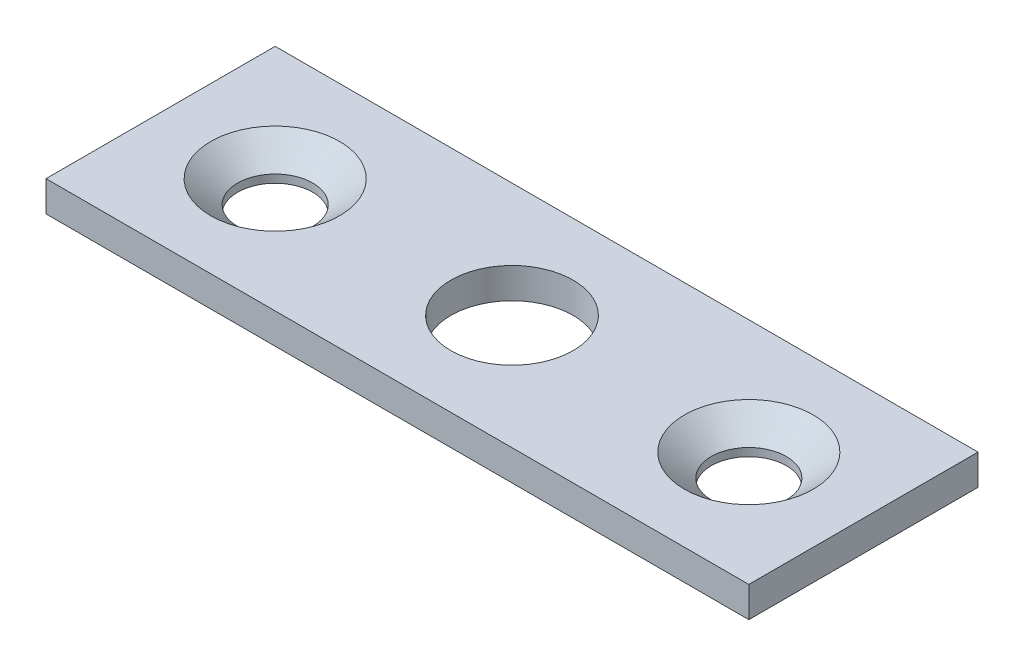
ISO-10303-21;
HEADER;
FILE_DESCRIPTION(('STEP AP214'),'2;1');
FILE_NAME('part.step','',(''),(''),'','','');
FILE_SCHEMA(('AUTOMOTIVE_DESIGN { 1 0 10303 214 1 1 1 1 }'));
ENDSEC;
DATA;
#1=APPLICATION_CONTEXT('core data for automotive mechanical design processes');
#2=APPLICATION_PROTOCOL_DEFINITION('international standard','automotive_design',2000,#1);
#3=PRODUCT_CONTEXT('',#1,'mechanical');
#4=PRODUCT('Part','Part','',(#3));
#5=PRODUCT_RELATED_PRODUCT_CATEGORY('part','',(#4));
#6=PRODUCT_DEFINITION_FORMATION('','',#4);
#7=PRODUCT_DEFINITION_CONTEXT('part definition',#1,'design');
#8=PRODUCT_DEFINITION('design','',#6,#7);
#9=PRODUCT_DEFINITION_SHAPE('','',#8);
#10=(LENGTH_UNIT() NAMED_UNIT(*) SI_UNIT(.MILLI.,.METRE.));
#11=(NAMED_UNIT(*) PLANE_ANGLE_UNIT() SI_UNIT($,.RADIAN.));
#12=(NAMED_UNIT(*) SI_UNIT($,.STERADIAN.) SOLID_ANGLE_UNIT());
#13=UNCERTAINTY_MEASURE_WITH_UNIT(LENGTH_MEASURE(1.E-05),#10,'distance_accuracy_value','');
#14=(GEOMETRIC_REPRESENTATION_CONTEXT(3) GLOBAL_UNCERTAINTY_ASSIGNED_CONTEXT((#13)) GLOBAL_UNIT_ASSIGNED_CONTEXT((#10,
#11,#12)) REPRESENTATION_CONTEXT('',''));
#15=CARTESIAN_POINT('',(0.,0.,0.));
#16=DIRECTION('',(0.,0.,1.));
#17=DIRECTION('',(1.,0.,0.));
#18=AXIS2_PLACEMENT_3D('',#15,#16,#17);
#19=CARTESIAN_POINT('',(0.,2.,0.));
#20=DIRECTION('',(0.,-1.,0.));
#21=DIRECTION('',(0.,0.,-1.));
#22=AXIS2_PLACEMENT_3D('',#19,#20,#21);
#23=PLANE('',#22);
#24=CARTESIAN_POINT('',(-15.5,2.,0.));
#25=DIRECTION('',(0.,1.,0.));
#26=DIRECTION('',(0.,0.,1.));
#27=AXIS2_PLACEMENT_3D('',#24,#25,#26);
#28=CIRCLE('',#27,4.2164);
#29=CARTESIAN_POINT('',(-15.5,2.,4.2164));
#30=VERTEX_POINT('',#29);
#31=EDGE_CURVE('E193',#30,#30,#28,.T.);
#32=ORIENTED_EDGE('',*,*,#31,.F.);
#33=EDGE_LOOP('',(#32));
#34=FACE_BOUND('',#33,.T.);
#35=CARTESIAN_POINT('',(15.5,2.,0.));
#36=DIRECTION('',(0.,1.,0.));
#37=DIRECTION('',(0.,0.,1.));
#38=AXIS2_PLACEMENT_3D('',#35,#36,#37);
#39=CIRCLE('',#38,4.2164);
#40=CARTESIAN_POINT('',(15.5,2.,4.2164));
#41=VERTEX_POINT('',#40);
#42=EDGE_CURVE('E125',#41,#41,#39,.T.);
#43=ORIENTED_EDGE('',*,*,#42,.F.);
#44=EDGE_LOOP('',(#43));
#45=FACE_BOUND('',#44,.T.);
#46=DIRECTION('',(0.,0.,-1.));
#47=VECTOR('',#46,1.);
#48=CARTESIAN_POINT('',(23.,2.,7.5));
#49=LINE('',#48,#47);
#50=CARTESIAN_POINT('',(23.,2.,7.5));
#51=VERTEX_POINT('',#50);
#52=CARTESIAN_POINT('',(23.,2.,-7.5));
#53=VERTEX_POINT('',#52);
#54=EDGE_CURVE('E95',#51,#53,#49,.T.);
#55=ORIENTED_EDGE('',*,*,#54,.T.);
#56=DIRECTION('',(-1.,0.,0.));
#57=VECTOR('',#56,1.);
#58=CARTESIAN_POINT('',(-23.,2.,-7.5));
#59=LINE('',#58,#57);
#60=CARTESIAN_POINT('',(-23.,2.,-7.5));
#61=VERTEX_POINT('',#60);
#62=EDGE_CURVE('E90',#53,#61,#59,.T.);
#63=ORIENTED_EDGE('',*,*,#62,.T.);
#64=DIRECTION('',(0.,0.,1.));
#65=VECTOR('',#64,1.);
#66=CARTESIAN_POINT('',(-23.,2.,7.5));
#67=LINE('',#66,#65);
#68=CARTESIAN_POINT('',(-23.,2.,7.5));
#69=VERTEX_POINT('',#68);
#70=EDGE_CURVE('E93',#61,#69,#67,.T.);
#71=ORIENTED_EDGE('',*,*,#70,.T.);
#72=DIRECTION('',(1.,0.,0.));
#73=VECTOR('',#72,1.);
#74=CARTESIAN_POINT('',(-23.,2.,7.5));
#75=LINE('',#74,#73);
#76=EDGE_CURVE('E60',#69,#51,#75,.T.);
#77=ORIENTED_EDGE('',*,*,#76,.T.);
#78=EDGE_LOOP('',(#55,#63,#71,#77));
#79=FACE_BOUND('',#78,.T.);
#80=CARTESIAN_POINT('',(0.,2.,0.));
#81=DIRECTION('',(0.,1.,0.));
#82=DIRECTION('',(0.,0.,1.));
#83=AXIS2_PLACEMENT_3D('',#80,#81,#82);
#84=CIRCLE('',#83,4.);
#85=CARTESIAN_POINT('',(0.,2.,4.));
#86=VERTEX_POINT('',#85);
#87=EDGE_CURVE('E111',#86,#86,#84,.T.);
#88=ORIENTED_EDGE('',*,*,#87,.F.);
#89=EDGE_LOOP('',(#88));
#90=FACE_BOUND('',#89,.T.);
#91=ADVANCED_FACE('F41',(#34,#45,#79,#90),#23,.F.);
#92=CARTESIAN_POINT('',(0.,0.,0.));
#93=DIRECTION('',(0.,-1.,0.));
#94=DIRECTION('',(0.,0.,-1.));
#95=AXIS2_PLACEMENT_3D('',#92,#93,#94);
#96=PLANE('',#95);
#97=CARTESIAN_POINT('',(-15.5,0.,0.));
#98=DIRECTION('',(0.,-1.,0.));
#99=DIRECTION('',(0.,0.,-1.));
#100=AXIS2_PLACEMENT_3D('',#97,#98,#99);
#101=CIRCLE('',#100,2.45744999999999);
#102=CARTESIAN_POINT('',(-15.5,0.,-2.45744999999999));
#103=VERTEX_POINT('',#102);
#104=EDGE_CURVE('E45',#103,#103,#101,.T.);
#105=ORIENTED_EDGE('',*,*,#104,.F.);
#106=EDGE_LOOP('',(#105));
#107=FACE_BOUND('',#106,.T.);
#108=CARTESIAN_POINT('',(15.5,0.,0.));
#109=DIRECTION('',(0.,-1.,0.));
#110=DIRECTION('',(0.,0.,-1.));
#111=AXIS2_PLACEMENT_3D('',#108,#109,#110);
#112=CIRCLE('',#111,2.45744999999999);
#113=CARTESIAN_POINT('',(15.5,0.,-2.45744999999999));
#114=VERTEX_POINT('',#113);
#115=EDGE_CURVE('E116',#114,#114,#112,.T.);
#116=ORIENTED_EDGE('',*,*,#115,.F.);
#117=EDGE_LOOP('',(#116));
#118=FACE_BOUND('',#117,.T.);
#119=DIRECTION('',(0.,0.,-1.));
#120=VECTOR('',#119,1.);
#121=CARTESIAN_POINT('',(23.,0.,7.5));
#122=LINE('',#121,#120);
#123=CARTESIAN_POINT('',(23.,0.,7.5));
#124=VERTEX_POINT('',#123);
#125=CARTESIAN_POINT('',(23.,0.,-7.5));
#126=VERTEX_POINT('',#125);
#127=EDGE_CURVE('E108',#124,#126,#122,.T.);
#128=ORIENTED_EDGE('',*,*,#127,.F.);
#129=DIRECTION('',(1.,0.,0.));
#130=VECTOR('',#129,1.);
#131=CARTESIAN_POINT('',(-23.,0.,7.5));
#132=LINE('',#131,#130);
#133=CARTESIAN_POINT('',(-23.,0.,7.5));
#134=VERTEX_POINT('',#133);
#135=EDGE_CURVE('E83',#134,#124,#132,.T.);
#136=ORIENTED_EDGE('',*,*,#135,.F.);
#137=DIRECTION('',(0.,0.,1.));
#138=VECTOR('',#137,1.);
#139=CARTESIAN_POINT('',(-23.,0.,7.5));
#140=LINE('',#139,#138);
#141=CARTESIAN_POINT('',(-23.,0.,-7.5));
#142=VERTEX_POINT('',#141);
#143=EDGE_CURVE('E77',#142,#134,#140,.T.);
#144=ORIENTED_EDGE('',*,*,#143,.F.);
#145=DIRECTION('',(-1.,0.,0.));
#146=VECTOR('',#145,1.);
#147=CARTESIAN_POINT('',(-23.,0.,-7.5));
#148=LINE('',#147,#146);
#149=EDGE_CURVE('E99',#126,#142,#148,.T.);
#150=ORIENTED_EDGE('',*,*,#149,.F.);
#151=EDGE_LOOP('',(#128,#136,#144,#150));
#152=FACE_BOUND('',#151,.T.);
#153=CARTESIAN_POINT('',(0.,0.,0.));
#154=DIRECTION('',(0.,1.,0.));
#155=DIRECTION('',(0.,0.,1.));
#156=AXIS2_PLACEMENT_3D('',#153,#154,#155);
#157=CIRCLE('',#156,4.);
#158=CARTESIAN_POINT('',(0.,0.,4.));
#159=VERTEX_POINT('',#158);
#160=EDGE_CURVE('E118',#159,#159,#157,.T.);
#161=ORIENTED_EDGE('',*,*,#160,.T.);
#162=EDGE_LOOP('',(#161));
#163=FACE_BOUND('',#162,.T.);
#164=ADVANCED_FACE('F139',(#107,#118,#152,#163),#96,.T.);
#165=CARTESIAN_POINT('',(23.,2.,7.5));
#166=DIRECTION('',(-1.,0.,0.));
#167=DIRECTION('',(0.,0.,1.));
#168=AXIS2_PLACEMENT_3D('',#165,#166,#167);
#169=PLANE('',#168);
#170=ORIENTED_EDGE('',*,*,#127,.T.);
#171=DIRECTION('',(0.,-1.,0.));
#172=VECTOR('',#171,1.);
#173=CARTESIAN_POINT('',(23.,2.,-7.5));
#174=LINE('',#173,#172);
#175=EDGE_CURVE('E11',#53,#126,#174,.T.);
#176=ORIENTED_EDGE('',*,*,#175,.F.);
#177=ORIENTED_EDGE('',*,*,#54,.F.);
#178=DIRECTION('',(0.,-1.,0.));
#179=VECTOR('',#178,1.);
#180=CARTESIAN_POINT('',(23.,2.,7.5));
#181=LINE('',#180,#179);
#182=EDGE_CURVE('E104',#51,#124,#181,.T.);
#183=ORIENTED_EDGE('',*,*,#182,.T.);
#184=EDGE_LOOP('',(#170,#176,#177,#183));
#185=FACE_BOUND('',#184,.T.);
#186=ADVANCED_FACE('F43',(#185),#169,.F.);
#187=CARTESIAN_POINT('',(-23.,2.,-7.5));
#188=DIRECTION('',(0.,0.,1.));
#189=DIRECTION('',(1.,0.,0.));
#190=AXIS2_PLACEMENT_3D('',#187,#188,#189);
#191=PLANE('',#190);
#192=ORIENTED_EDGE('',*,*,#149,.T.);
#193=DIRECTION('',(0.,-1.,0.));
#194=VECTOR('',#193,1.);
#195=CARTESIAN_POINT('',(-23.,2.,-7.5));
#196=LINE('',#195,#194);
#197=EDGE_CURVE('E51',#61,#142,#196,.T.);
#198=ORIENTED_EDGE('',*,*,#197,.F.);
#199=ORIENTED_EDGE('',*,*,#62,.F.);
#200=ORIENTED_EDGE('',*,*,#175,.T.);
#201=EDGE_LOOP('',(#192,#198,#199,#200));
#202=FACE_BOUND('',#201,.T.);
#203=ADVANCED_FACE('F98',(#202),#191,.F.);
#204=CARTESIAN_POINT('',(-23.,2.,7.5));
#205=DIRECTION('',(1.,0.,0.));
#206=DIRECTION('',(0.,0.,-1.));
#207=AXIS2_PLACEMENT_3D('',#204,#205,#206);
#208=PLANE('',#207);
#209=ORIENTED_EDGE('',*,*,#143,.T.);
#210=DIRECTION('',(0.,-1.,0.));
#211=VECTOR('',#210,1.);
#212=CARTESIAN_POINT('',(-23.,2.,7.5));
#213=LINE('',#212,#211);
#214=EDGE_CURVE('E100',#69,#134,#213,.T.);
#215=ORIENTED_EDGE('',*,*,#214,.F.);
#216=ORIENTED_EDGE('',*,*,#70,.F.);
#217=ORIENTED_EDGE('',*,*,#197,.T.);
#218=EDGE_LOOP('',(#209,#215,#216,#217));
#219=FACE_BOUND('',#218,.T.);
#220=ADVANCED_FACE('F102',(#219),#208,.F.);
#221=CARTESIAN_POINT('',(-23.,2.,7.5));
#222=DIRECTION('',(0.,0.,-1.));
#223=DIRECTION('',(-1.,0.,0.));
#224=AXIS2_PLACEMENT_3D('',#221,#222,#223);
#225=PLANE('',#224);
#226=ORIENTED_EDGE('',*,*,#135,.T.);
#227=ORIENTED_EDGE('',*,*,#182,.F.);
#228=ORIENTED_EDGE('',*,*,#76,.F.);
#229=ORIENTED_EDGE('',*,*,#214,.T.);
#230=EDGE_LOOP('',(#226,#227,#228,#229));
#231=FACE_BOUND('',#230,.T.);
#232=ADVANCED_FACE('F153',(#231),#225,.F.);
#233=CARTESIAN_POINT('',(0.,2.,0.));
#234=DIRECTION('',(0.,-1.,0.));
#235=DIRECTION('',(0.,0.,-1.));
#236=AXIS2_PLACEMENT_3D('',#233,#234,#235);
#237=CYLINDRICAL_SURFACE('',#236,4.);
#238=ORIENTED_EDGE('',*,*,#87,.T.);
#239=EDGE_LOOP('',(#238));
#240=FACE_BOUND('',#239,.T.);
#241=ORIENTED_EDGE('',*,*,#160,.F.);
#242=EDGE_LOOP('',(#241));
#243=FACE_BOUND('',#242,.T.);
#244=ADVANCED_FACE('F136',(#240,#243),#237,.F.);
#245=CARTESIAN_POINT('',(15.5,2.,0.));
#246=DIRECTION('',(0.,1.,0.));
#247=DIRECTION('',(0.,0.,1.));
#248=AXIS2_PLACEMENT_3D('',#245,#246,#247);
#249=CYLINDRICAL_SURFACE('',#248,2.45744999999999);
#250=ORIENTED_EDGE('',*,*,#115,.T.);
#251=EDGE_LOOP('',(#250));
#252=FACE_BOUND('',#251,.T.);
#253=CARTESIAN_POINT('',(15.5,0.524065703740717,0.));
#254=DIRECTION('',(0.,1.,0.));
#255=DIRECTION('',(0.,0.,1.));
#256=AXIS2_PLACEMENT_3D('',#253,#254,#255);
#257=CIRCLE('',#256,2.45745);
#258=CARTESIAN_POINT('',(15.5,0.524065703740717,2.45745));
#259=VERTEX_POINT('',#258);
#260=EDGE_CURVE('E119',#259,#259,#257,.T.);
#261=ORIENTED_EDGE('',*,*,#260,.T.);
#262=EDGE_LOOP('',(#261));
#263=FACE_BOUND('',#262,.T.);
#264=ADVANCED_FACE('F168',(#252,#263),#249,.F.);
#265=CARTESIAN_POINT('',(15.5,2.,0.));
#266=DIRECTION('',(0.,1.,0.));
#267=DIRECTION('',(0.,0.,1.));
#268=AXIS2_PLACEMENT_3D('',#265,#266,#267);
#269=CONICAL_SURFACE('',#268,4.2164,0.872664625997164);
#270=ORIENTED_EDGE('',*,*,#260,.F.);
#271=EDGE_LOOP('',(#270));
#272=FACE_BOUND('',#271,.T.);
#273=ORIENTED_EDGE('',*,*,#42,.T.);
#274=EDGE_LOOP('',(#273));
#275=FACE_BOUND('',#274,.T.);
#276=ADVANCED_FACE('F172',(#272,#275),#269,.F.);
#277=CARTESIAN_POINT('',(-15.5,2.,0.));
#278=DIRECTION('',(0.,1.,0.));
#279=DIRECTION('',(0.,0.,1.));
#280=AXIS2_PLACEMENT_3D('',#277,#278,#279);
#281=CYLINDRICAL_SURFACE('',#280,2.45744999999999);
#282=ORIENTED_EDGE('',*,*,#104,.T.);
#283=EDGE_LOOP('',(#282));
#284=FACE_BOUND('',#283,.T.);
#285=CARTESIAN_POINT('',(-15.5,0.524065703740717,0.));
#286=DIRECTION('',(0.,1.,0.));
#287=DIRECTION('',(0.,0.,1.));
#288=AXIS2_PLACEMENT_3D('',#285,#286,#287);
#289=CIRCLE('',#288,2.45745);
#290=CARTESIAN_POINT('',(-15.5,0.524065703740717,2.45745));
#291=VERTEX_POINT('',#290);
#292=EDGE_CURVE('E191',#291,#291,#289,.T.);
#293=ORIENTED_EDGE('',*,*,#292,.T.);
#294=EDGE_LOOP('',(#293));
#295=FACE_BOUND('',#294,.T.);
#296=ADVANCED_FACE('F176',(#284,#295),#281,.F.);
#297=CARTESIAN_POINT('',(-15.5,2.,0.));
#298=DIRECTION('',(0.,1.,0.));
#299=DIRECTION('',(0.,0.,1.));
#300=AXIS2_PLACEMENT_3D('',#297,#298,#299);
#301=CONICAL_SURFACE('',#300,4.2164,0.872664625997163);
#302=ORIENTED_EDGE('',*,*,#292,.F.);
#303=EDGE_LOOP('',(#302));
#304=FACE_BOUND('',#303,.T.);
#305=ORIENTED_EDGE('',*,*,#31,.T.);
#306=EDGE_LOOP('',(#305));
#307=FACE_BOUND('',#306,.T.);
#308=ADVANCED_FACE('F182',(#304,#307),#301,.F.);
#309=CLOSED_SHELL('',(#91,#164,#186,#203,#220,#232,#244,#264,#276,#296,#308));
#310=MANIFOLD_SOLID_BREP('B2',#309);
#311=ADVANCED_BREP_SHAPE_REPRESENTATION('',(#18,#310),#14);
#312=SHAPE_DEFINITION_REPRESENTATION(#9,#311);
ENDSEC;
END-ISO-10303-21;
